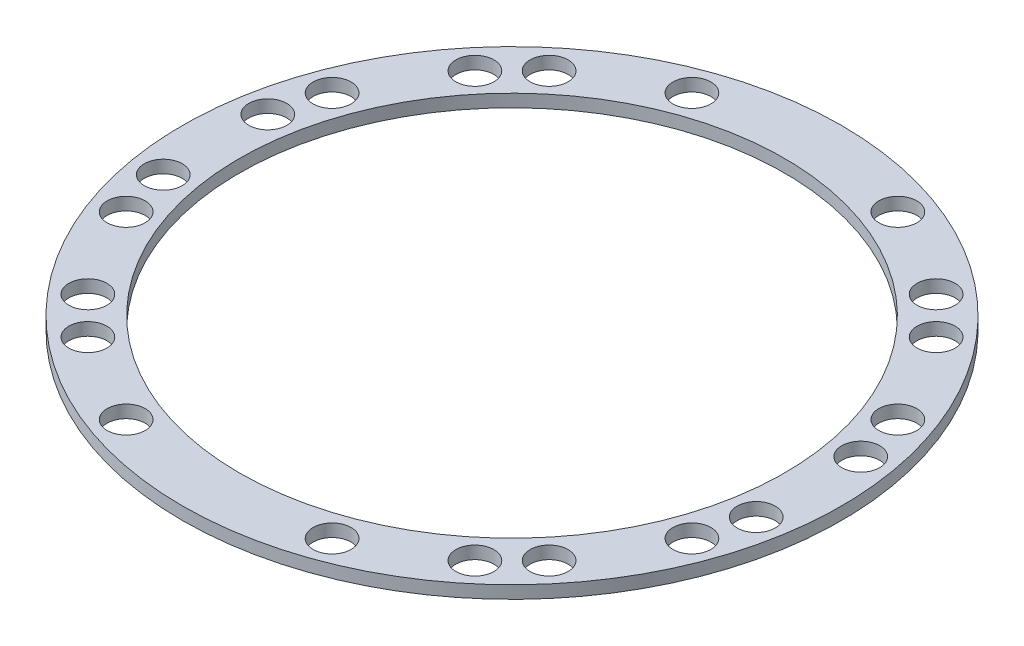
ISO-10303-21;
HEADER;
FILE_DESCRIPTION(('STEP AP214'),'2;1');
FILE_NAME('part.step','',(''),(''),'','','');
FILE_SCHEMA(('AUTOMOTIVE_DESIGN { 1 0 10303 214 1 1 1 1 }'));
ENDSEC;
DATA;
#1=APPLICATION_CONTEXT('core data for automotive mechanical design processes');
#2=APPLICATION_PROTOCOL_DEFINITION('international standard','automotive_design',2000,#1);
#3=PRODUCT_CONTEXT('',#1,'mechanical');
#4=PRODUCT('Part','Part','',(#3));
#5=PRODUCT_RELATED_PRODUCT_CATEGORY('part','',(#4));
#6=PRODUCT_DEFINITION_FORMATION('','',#4);
#7=PRODUCT_DEFINITION_CONTEXT('part definition',#1,'design');
#8=PRODUCT_DEFINITION('design','',#6,#7);
#9=PRODUCT_DEFINITION_SHAPE('','',#8);
#10=(LENGTH_UNIT() NAMED_UNIT(*) SI_UNIT(.MILLI.,.METRE.));
#11=(NAMED_UNIT(*) PLANE_ANGLE_UNIT() SI_UNIT($,.RADIAN.));
#12=(NAMED_UNIT(*) SI_UNIT($,.STERADIAN.) SOLID_ANGLE_UNIT());
#13=UNCERTAINTY_MEASURE_WITH_UNIT(LENGTH_MEASURE(1.E-05),#10,'distance_accuracy_value','');
#14=(GEOMETRIC_REPRESENTATION_CONTEXT(3) GLOBAL_UNCERTAINTY_ASSIGNED_CONTEXT((#13)) GLOBAL_UNIT_ASSIGNED_CONTEXT((#10,
#11,#12)) REPRESENTATION_CONTEXT('',''));
#15=CARTESIAN_POINT('',(0.,0.,0.));
#16=DIRECTION('',(0.,0.,1.));
#17=DIRECTION('',(1.,0.,0.));
#18=AXIS2_PLACEMENT_3D('',#15,#16,#17);
#19=CARTESIAN_POINT('',(0.,100.,0.));
#20=DIRECTION('',(0.,1.,0.));
#21=DIRECTION('',(0.,0.,1.));
#22=AXIS2_PLACEMENT_3D('',#19,#20,#21);
#23=PLANE('',#22);
#24=CARTESIAN_POINT('',(-2231.76997436654,100.,812.297840398455));
#25=DIRECTION('',(0.,-1.,0.));
#26=DIRECTION('',(-0.500000000000001,0.,0.866025403784438));
#27=AXIS2_PLACEMENT_3D('',#24,#25,#26);
#28=CIRCLE('',#27,150.);
#29=CARTESIAN_POINT('',(-2306.76997436654,100.,942.201650966121));
#30=VERTEX_POINT('',#29);
#31=EDGE_CURVE('E171',#30,#30,#28,.T.);
#32=ORIENTED_EDGE('',*,*,#31,.T.);
#33=EDGE_LOOP('',(#32));
#34=FACE_BOUND('',#33,.T.);
#35=CARTESIAN_POINT('',(-2338.91841340399,100.,-412.414421958971));
#36=DIRECTION('',(0.,-1.,0.));
#37=DIRECTION('',(-0.86602540378444,0.,0.499999999999998));
#38=AXIS2_PLACEMENT_3D('',#35,#36,#37);
#39=CIRCLE('',#38,150.);
#40=CARTESIAN_POINT('',(-2468.82222397166,100.,-337.414421958971));
#41=VERTEX_POINT('',#40);
#42=EDGE_CURVE('E211',#41,#41,#39,.T.);
#43=ORIENTED_EDGE('',*,*,#42,.T.);
#44=EDGE_LOOP('',(#43));
#45=FACE_BOUND('',#44,.T.);
#46=CARTESIAN_POINT('',(-1819.35555240756,100.,-1526.62057300554));
#47=DIRECTION('',(0.,-1.,0.));
#48=DIRECTION('',(-1.,0.,0.));
#49=AXIS2_PLACEMENT_3D('',#46,#47,#48);
#50=CIRCLE('',#49,150.);
#51=CARTESIAN_POINT('',(-1969.35555240756,100.,-1526.62057300554));
#52=VERTEX_POINT('',#51);
#53=EDGE_CURVE('E203',#52,#52,#50,.T.);
#54=ORIENTED_EDGE('',*,*,#53,.T.);
#55=EDGE_LOOP('',(#54));
#56=FACE_BOUND('',#55,.T.);
#57=CARTESIAN_POINT('',(-812.297840398448,100.,-2231.76997436654));
#58=DIRECTION('',(0.,-1.,0.));
#59=DIRECTION('',(-0.866025403784436,0.,-0.500000000000004));
#60=AXIS2_PLACEMENT_3D('',#57,#58,#59);
#61=CIRCLE('',#60,150.);
#62=CARTESIAN_POINT('',(-942.201650966113,100.,-2306.76997436654));
#63=VERTEX_POINT('',#62);
#64=EDGE_CURVE('E194',#63,#63,#61,.T.);
#65=ORIENTED_EDGE('',*,*,#64,.T.);
#66=EDGE_LOOP('',(#65));
#67=FACE_BOUND('',#66,.T.);
#68=CARTESIAN_POINT('',(-1819.35555240758,100.,1526.62057300553));
#69=DIRECTION('',(0.,-1.,0.));
#70=DIRECTION('',(-0.500000000000001,0.,0.866025403784438));
#71=AXIS2_PLACEMENT_3D('',#68,#69,#70);
#72=CIRCLE('',#71,150.);
#73=CARTESIAN_POINT('',(-1894.35555240758,100.,1656.52438357319));
#74=VERTEX_POINT('',#73);
#75=EDGE_CURVE('E151',#74,#74,#72,.T.);
#76=ORIENTED_EDGE('',*,*,#75,.T.);
#77=EDGE_LOOP('',(#76));
#78=FACE_BOUND('',#77,.T.);
#79=CARTESIAN_POINT('',(-2338.918413404,100.,412.414421958951));
#80=DIRECTION('',(0.,-1.,0.));
#81=DIRECTION('',(-0.86602540378444,0.,0.499999999999998));
#82=AXIS2_PLACEMENT_3D('',#79,#80,#81);
#83=CIRCLE('',#82,150.);
#84=CARTESIAN_POINT('',(-2468.82222397166,100.,487.414421958951));
#85=VERTEX_POINT('',#84);
#86=EDGE_CURVE('E180',#85,#85,#83,.T.);
#87=ORIENTED_EDGE('',*,*,#86,.T.);
#88=EDGE_LOOP('',(#87));
#89=FACE_BOUND('',#88,.T.);
#90=CARTESIAN_POINT('',(-2231.76997436653,100.,-812.297840398474));
#91=DIRECTION('',(0.,-1.,0.));
#92=DIRECTION('',(-1.,0.,0.));
#93=AXIS2_PLACEMENT_3D('',#90,#91,#92);
#94=CIRCLE('',#93,150.);
#95=CARTESIAN_POINT('',(-2381.76997436653,100.,-812.297840398474));
#96=VERTEX_POINT('',#95);
#97=EDGE_CURVE('E172',#96,#96,#94,.T.);
#98=ORIENTED_EDGE('',*,*,#97,.T.);
#99=EDGE_LOOP('',(#98));
#100=FACE_BOUND('',#99,.T.);
#101=CARTESIAN_POINT('',(-1526.62057300552,100.,-1819.35555240758));
#102=DIRECTION('',(0.,-1.,0.));
#103=DIRECTION('',(-0.866025403784436,0.,-0.500000000000004));
#104=AXIS2_PLACEMENT_3D('',#101,#102,#103);
#105=CIRCLE('',#104,150.);
#106=CARTESIAN_POINT('',(-1656.52438357319,100.,-1894.35555240758));
#107=VERTEX_POINT('',#106);
#108=EDGE_CURVE('E162',#107,#107,#105,.T.);
#109=ORIENTED_EDGE('',*,*,#108,.T.);
#110=EDGE_LOOP('',(#109));
#111=FACE_BOUND('',#110,.T.);
#112=CARTESIAN_POINT('',(-812.297840398466,100.,2231.76997436653));
#113=DIRECTION('',(0.,-1.,0.));
#114=DIRECTION('',(0.,0.,1.));
#115=AXIS2_PLACEMENT_3D('',#112,#113,#114);
#116=CIRCLE('',#115,150.);
#117=CARTESIAN_POINT('',(-812.297840398466,100.,2381.76997436653));
#118=VERTEX_POINT('',#117);
#119=EDGE_CURVE('E155',#118,#118,#116,.T.);
#120=ORIENTED_EDGE('',*,*,#119,.T.);
#121=EDGE_LOOP('',(#120));
#122=FACE_BOUND('',#121,.T.);
#123=CARTESIAN_POINT('',(-1526.62057300554,100.,1819.35555240757));
#124=DIRECTION('',(0.,-1.,0.));
#125=DIRECTION('',(0.,0.,1.));
#126=AXIS2_PLACEMENT_3D('',#123,#124,#125);
#127=CIRCLE('',#126,150.);
#128=CARTESIAN_POINT('',(-1526.62057300554,100.,1969.35555240757));
#129=VERTEX_POINT('',#128);
#130=EDGE_CURVE('E146',#129,#129,#127,.T.);
#131=ORIENTED_EDGE('',*,*,#130,.T.);
#132=EDGE_LOOP('',(#131));
#133=FACE_BOUND('',#132,.T.);
#134=CARTESIAN_POINT('',(2231.76997436654,100.,812.297840398455));
#135=DIRECTION('',(0.,1.,0.));
#136=DIRECTION('',(0.500000000000001,0.,0.866025403784438));
#137=AXIS2_PLACEMENT_3D('',#134,#135,#136);
#138=CIRCLE('',#137,150.);
#139=CARTESIAN_POINT('',(2306.76997436654,100.,942.201650966121));
#140=VERTEX_POINT('',#139);
#141=EDGE_CURVE('E91',#140,#140,#138,.T.);
#142=ORIENTED_EDGE('',*,*,#141,.F.);
#143=EDGE_LOOP('',(#142));
#144=FACE_BOUND('',#143,.T.);
#145=CARTESIAN_POINT('',(2338.91841340399,100.,-412.414421958971));
#146=DIRECTION('',(0.,1.,0.));
#147=DIRECTION('',(0.86602540378444,0.,0.499999999999998));
#148=AXIS2_PLACEMENT_3D('',#145,#146,#147);
#149=CIRCLE('',#148,150.);
#150=CARTESIAN_POINT('',(2468.82222397166,100.,-337.414421958971));
#151=VERTEX_POINT('',#150);
#152=EDGE_CURVE('E132',#151,#151,#149,.T.);
#153=ORIENTED_EDGE('',*,*,#152,.F.);
#154=EDGE_LOOP('',(#153));
#155=FACE_BOUND('',#154,.T.);
#156=CARTESIAN_POINT('',(1819.35555240756,100.,-1526.62057300554));
#157=DIRECTION('',(0.,1.,0.));
#158=DIRECTION('',(1.,0.,0.));
#159=AXIS2_PLACEMENT_3D('',#156,#157,#158);
#160=CIRCLE('',#159,150.);
#161=CARTESIAN_POINT('',(1969.35555240756,100.,-1526.62057300554));
#162=VERTEX_POINT('',#161);
#163=EDGE_CURVE('E124',#162,#162,#160,.T.);
#164=ORIENTED_EDGE('',*,*,#163,.F.);
#165=EDGE_LOOP('',(#164));
#166=FACE_BOUND('',#165,.T.);
#167=CARTESIAN_POINT('',(812.297840398448,100.,-2231.76997436654));
#168=DIRECTION('',(0.,1.,0.));
#169=DIRECTION('',(0.866025403784436,0.,-0.500000000000004));
#170=AXIS2_PLACEMENT_3D('',#167,#168,#169);
#171=CIRCLE('',#170,150.);
#172=CARTESIAN_POINT('',(942.201650966113,100.,-2306.76997436654));
#173=VERTEX_POINT('',#172);
#174=EDGE_CURVE('E114',#173,#173,#171,.T.);
#175=ORIENTED_EDGE('',*,*,#174,.F.);
#176=EDGE_LOOP('',(#175));
#177=FACE_BOUND('',#176,.T.);
#178=CARTESIAN_POINT('',(1819.35555240758,100.,1526.62057300553));
#179=DIRECTION('',(0.,1.,0.));
#180=DIRECTION('',(0.500000000000001,0.,0.866025403784438));
#181=AXIS2_PLACEMENT_3D('',#178,#179,#180);
#182=CIRCLE('',#181,150.);
#183=CARTESIAN_POINT('',(1894.35555240758,100.,1656.52438357319));
#184=VERTEX_POINT('',#183);
#185=EDGE_CURVE('E71',#184,#184,#182,.T.);
#186=ORIENTED_EDGE('',*,*,#185,.F.);
#187=EDGE_LOOP('',(#186));
#188=FACE_BOUND('',#187,.T.);
#189=CARTESIAN_POINT('',(2338.918413404,100.,412.414421958951));
#190=DIRECTION('',(0.,1.,0.));
#191=DIRECTION('',(0.86602540378444,0.,0.499999999999998));
#192=AXIS2_PLACEMENT_3D('',#189,#190,#191);
#193=CIRCLE('',#192,150.);
#194=CARTESIAN_POINT('',(2468.82222397166,100.,487.414421958951));
#195=VERTEX_POINT('',#194);
#196=EDGE_CURVE('E100',#195,#195,#193,.T.);
#197=ORIENTED_EDGE('',*,*,#196,.F.);
#198=EDGE_LOOP('',(#197));
#199=FACE_BOUND('',#198,.T.);
#200=CARTESIAN_POINT('',(2231.76997436653,100.,-812.297840398474));
#201=DIRECTION('',(0.,1.,0.));
#202=DIRECTION('',(1.,0.,0.));
#203=AXIS2_PLACEMENT_3D('',#200,#201,#202);
#204=CIRCLE('',#203,150.);
#205=CARTESIAN_POINT('',(2381.76997436653,100.,-812.297840398474));
#206=VERTEX_POINT('',#205);
#207=EDGE_CURVE('E92',#206,#206,#204,.T.);
#208=ORIENTED_EDGE('',*,*,#207,.F.);
#209=EDGE_LOOP('',(#208));
#210=FACE_BOUND('',#209,.T.);
#211=CARTESIAN_POINT('',(1526.62057300552,100.,-1819.35555240758));
#212=DIRECTION('',(0.,1.,0.));
#213=DIRECTION('',(0.866025403784436,0.,-0.500000000000004));
#214=AXIS2_PLACEMENT_3D('',#211,#212,#213);
#215=CIRCLE('',#214,150.);
#216=CARTESIAN_POINT('',(1656.52438357319,100.,-1894.35555240758));
#217=VERTEX_POINT('',#216);
#218=EDGE_CURVE('E82',#217,#217,#215,.T.);
#219=ORIENTED_EDGE('',*,*,#218,.F.);
#220=EDGE_LOOP('',(#219));
#221=FACE_BOUND('',#220,.T.);
#222=CARTESIAN_POINT('',(812.297840398466,100.,2231.76997436653));
#223=DIRECTION('',(0.,1.,0.));
#224=DIRECTION('',(0.,0.,1.));
#225=AXIS2_PLACEMENT_3D('',#222,#223,#224);
#226=CIRCLE('',#225,150.);
#227=CARTESIAN_POINT('',(812.297840398466,100.,2381.76997436653));
#228=VERTEX_POINT('',#227);
#229=EDGE_CURVE('E75',#228,#228,#226,.T.);
#230=ORIENTED_EDGE('',*,*,#229,.F.);
#231=EDGE_LOOP('',(#230));
#232=FACE_BOUND('',#231,.T.);
#233=CARTESIAN_POINT('',(1526.62057300554,100.,1819.35555240757));
#234=DIRECTION('',(0.,1.,0.));
#235=DIRECTION('',(0.,0.,1.));
#236=AXIS2_PLACEMENT_3D('',#233,#234,#235);
#237=CIRCLE('',#236,150.);
#238=CARTESIAN_POINT('',(1526.62057300554,100.,1969.35555240757));
#239=VERTEX_POINT('',#238);
#240=EDGE_CURVE('E70',#239,#239,#237,.T.);
#241=ORIENTED_EDGE('',*,*,#240,.F.);
#242=EDGE_LOOP('',(#241));
#243=FACE_BOUND('',#242,.T.);
#244=CARTESIAN_POINT('',(0.,100.,0.));
#245=DIRECTION('',(0.,1.,0.));
#246=DIRECTION('',(0.,0.,1.));
#247=AXIS2_PLACEMENT_3D('',#244,#245,#246);
#248=CIRCLE('',#247,2600.);
#249=CARTESIAN_POINT('',(0.,100.,2600.));
#250=VERTEX_POINT('',#249);
#251=EDGE_CURVE('E10',#250,#250,#248,.T.);
#252=ORIENTED_EDGE('',*,*,#251,.T.);
#253=EDGE_LOOP('',(#252));
#254=FACE_BOUND('',#253,.T.);
#255=CARTESIAN_POINT('',(0.,100.,0.));
#256=DIRECTION('',(0.,1.,0.));
#257=DIRECTION('',(0.,0.,1.));
#258=AXIS2_PLACEMENT_3D('',#255,#256,#257);
#259=CIRCLE('',#258,2150.);
#260=CARTESIAN_POINT('',(0.,100.,2150.));
#261=VERTEX_POINT('',#260);
#262=EDGE_CURVE('E56',#261,#261,#259,.T.);
#263=ORIENTED_EDGE('',*,*,#262,.F.);
#264=EDGE_LOOP('',(#263));
#265=FACE_BOUND('',#264,.T.);
#266=ADVANCED_FACE('F43',(#34,#45,#56,#67,#78,#89,#100,#111,#122,#133,#144,#155,#166,#177,#188,
#199,#210,#221,#232,#243,#254,#265),#23,.T.);
#267=CARTESIAN_POINT('',(0.,0.,0.));
#268=DIRECTION('',(0.,1.,0.));
#269=DIRECTION('',(0.,0.,1.));
#270=AXIS2_PLACEMENT_3D('',#267,#268,#269);
#271=PLANE('',#270);
#272=CARTESIAN_POINT('',(-2231.76997436654,0.,812.297840398455));
#273=DIRECTION('',(0.,-1.,0.));
#274=DIRECTION('',(-0.500000000000001,0.,0.866025403784438));
#275=AXIS2_PLACEMENT_3D('',#272,#273,#274);
#276=CIRCLE('',#275,150.);
#277=CARTESIAN_POINT('',(-2306.76997436654,0.,942.201650966121));
#278=VERTEX_POINT('',#277);
#279=EDGE_CURVE('E215',#278,#278,#276,.T.);
#280=ORIENTED_EDGE('',*,*,#279,.F.);
#281=EDGE_LOOP('',(#280));
#282=FACE_BOUND('',#281,.T.);
#283=CARTESIAN_POINT('',(-2338.91841340399,0.,-412.414421958971));
#284=DIRECTION('',(0.,-1.,0.));
#285=DIRECTION('',(-0.86602540378444,0.,0.499999999999998));
#286=AXIS2_PLACEMENT_3D('',#283,#284,#285);
#287=CIRCLE('',#286,150.);
#288=CARTESIAN_POINT('',(-2468.82222397166,0.,-337.414421958971));
#289=VERTEX_POINT('',#288);
#290=EDGE_CURVE('E207',#289,#289,#287,.T.);
#291=ORIENTED_EDGE('',*,*,#290,.F.);
#292=EDGE_LOOP('',(#291));
#293=FACE_BOUND('',#292,.T.);
#294=CARTESIAN_POINT('',(-1819.35555240756,0.,-1526.62057300554));
#295=DIRECTION('',(0.,-1.,0.));
#296=DIRECTION('',(-1.,0.,0.));
#297=AXIS2_PLACEMENT_3D('',#294,#295,#296);
#298=CIRCLE('',#297,150.);
#299=CARTESIAN_POINT('',(-1969.35555240756,0.,-1526.62057300554));
#300=VERTEX_POINT('',#299);
#301=EDGE_CURVE('E198',#300,#300,#298,.T.);
#302=ORIENTED_EDGE('',*,*,#301,.F.);
#303=EDGE_LOOP('',(#302));
#304=FACE_BOUND('',#303,.T.);
#305=CARTESIAN_POINT('',(-812.297840398448,0.,-2231.76997436654));
#306=DIRECTION('',(0.,-1.,0.));
#307=DIRECTION('',(-0.866025403784436,0.,-0.500000000000004));
#308=AXIS2_PLACEMENT_3D('',#305,#306,#307);
#309=CIRCLE('',#308,150.);
#310=CARTESIAN_POINT('',(-942.201650966113,0.,-2306.76997436654));
#311=VERTEX_POINT('',#310);
#312=EDGE_CURVE('E199',#311,#311,#309,.T.);
#313=ORIENTED_EDGE('',*,*,#312,.F.);
#314=EDGE_LOOP('',(#313));
#315=FACE_BOUND('',#314,.T.);
#316=CARTESIAN_POINT('',(-1819.35555240758,0.,1526.62057300553));
#317=DIRECTION('',(0.,-1.,0.));
#318=DIRECTION('',(-0.500000000000001,0.,0.866025403784438));
#319=AXIS2_PLACEMENT_3D('',#316,#317,#318);
#320=CIRCLE('',#319,150.);
#321=CARTESIAN_POINT('',(-1894.35555240758,0.,1656.52438357319));
#322=VERTEX_POINT('',#321);
#323=EDGE_CURVE('E184',#322,#322,#320,.T.);
#324=ORIENTED_EDGE('',*,*,#323,.F.);
#325=EDGE_LOOP('',(#324));
#326=FACE_BOUND('',#325,.T.);
#327=CARTESIAN_POINT('',(-2338.918413404,0.,412.414421958951));
#328=DIRECTION('',(0.,-1.,0.));
#329=DIRECTION('',(-0.86602540378444,0.,0.499999999999998));
#330=AXIS2_PLACEMENT_3D('',#327,#328,#329);
#331=CIRCLE('',#330,150.);
#332=CARTESIAN_POINT('',(-2468.82222397166,0.,487.414421958951));
#333=VERTEX_POINT('',#332);
#334=EDGE_CURVE('E176',#333,#333,#331,.T.);
#335=ORIENTED_EDGE('',*,*,#334,.F.);
#336=EDGE_LOOP('',(#335));
#337=FACE_BOUND('',#336,.T.);
#338=CARTESIAN_POINT('',(-2231.76997436653,0.,-812.297840398474));
#339=DIRECTION('',(0.,-1.,0.));
#340=DIRECTION('',(-1.,0.,0.));
#341=AXIS2_PLACEMENT_3D('',#338,#339,#340);
#342=CIRCLE('',#341,150.);
#343=CARTESIAN_POINT('',(-2381.76997436653,0.,-812.297840398474));
#344=VERTEX_POINT('',#343);
#345=EDGE_CURVE('E166',#344,#344,#342,.T.);
#346=ORIENTED_EDGE('',*,*,#345,.F.);
#347=EDGE_LOOP('',(#346));
#348=FACE_BOUND('',#347,.T.);
#349=CARTESIAN_POINT('',(-1526.62057300552,0.,-1819.35555240758));
#350=DIRECTION('',(0.,-1.,0.));
#351=DIRECTION('',(-0.866025403784436,0.,-0.500000000000004));
#352=AXIS2_PLACEMENT_3D('',#349,#350,#351);
#353=CIRCLE('',#352,150.);
#354=CARTESIAN_POINT('',(-1656.52438357319,0.,-1894.35555240758));
#355=VERTEX_POINT('',#354);
#356=EDGE_CURVE('E167',#355,#355,#353,.T.);
#357=ORIENTED_EDGE('',*,*,#356,.F.);
#358=EDGE_LOOP('',(#357));
#359=FACE_BOUND('',#358,.T.);
#360=CARTESIAN_POINT('',(-812.297840398466,0.,2231.76997436653));
#361=DIRECTION('',(0.,-1.,0.));
#362=DIRECTION('',(0.,0.,1.));
#363=AXIS2_PLACEMENT_3D('',#360,#361,#362);
#364=CIRCLE('',#363,150.);
#365=CARTESIAN_POINT('',(-812.297840398466,0.,2381.76997436653));
#366=VERTEX_POINT('',#365);
#367=EDGE_CURVE('E123',#366,#366,#364,.T.);
#368=ORIENTED_EDGE('',*,*,#367,.F.);
#369=EDGE_LOOP('',(#368));
#370=FACE_BOUND('',#369,.T.);
#371=CARTESIAN_POINT('',(-1526.62057300554,0.,1819.35555240757));
#372=DIRECTION('',(0.,-1.,0.));
#373=DIRECTION('',(0.,0.,1.));
#374=AXIS2_PLACEMENT_3D('',#371,#372,#373);
#375=CIRCLE('',#374,150.);
#376=CARTESIAN_POINT('',(-1526.62057300554,0.,1969.35555240757));
#377=VERTEX_POINT('',#376);
#378=EDGE_CURVE('E150',#377,#377,#375,.T.);
#379=ORIENTED_EDGE('',*,*,#378,.F.);
#380=EDGE_LOOP('',(#379));
#381=FACE_BOUND('',#380,.T.);
#382=CARTESIAN_POINT('',(2231.76997436654,0.,812.297840398455));
#383=DIRECTION('',(0.,1.,0.));
#384=DIRECTION('',(0.500000000000001,0.,0.866025403784438));
#385=AXIS2_PLACEMENT_3D('',#382,#383,#384);
#386=CIRCLE('',#385,150.);
#387=CARTESIAN_POINT('',(2306.76997436654,0.,942.201650966121));
#388=VERTEX_POINT('',#387);
#389=EDGE_CURVE('E136',#388,#388,#386,.T.);
#390=ORIENTED_EDGE('',*,*,#389,.T.);
#391=EDGE_LOOP('',(#390));
#392=FACE_BOUND('',#391,.T.);
#393=CARTESIAN_POINT('',(2338.91841340399,0.,-412.414421958971));
#394=DIRECTION('',(0.,1.,0.));
#395=DIRECTION('',(0.86602540378444,0.,0.499999999999998));
#396=AXIS2_PLACEMENT_3D('',#393,#394,#395);
#397=CIRCLE('',#396,150.);
#398=CARTESIAN_POINT('',(2468.82222397166,0.,-337.414421958971));
#399=VERTEX_POINT('',#398);
#400=EDGE_CURVE('E128',#399,#399,#397,.T.);
#401=ORIENTED_EDGE('',*,*,#400,.T.);
#402=EDGE_LOOP('',(#401));
#403=FACE_BOUND('',#402,.T.);
#404=CARTESIAN_POINT('',(1819.35555240756,0.,-1526.62057300554));
#405=DIRECTION('',(0.,1.,0.));
#406=DIRECTION('',(1.,0.,0.));
#407=AXIS2_PLACEMENT_3D('',#404,#405,#406);
#408=CIRCLE('',#407,150.);
#409=CARTESIAN_POINT('',(1969.35555240756,0.,-1526.62057300554));
#410=VERTEX_POINT('',#409);
#411=EDGE_CURVE('E118',#410,#410,#408,.T.);
#412=ORIENTED_EDGE('',*,*,#411,.T.);
#413=EDGE_LOOP('',(#412));
#414=FACE_BOUND('',#413,.T.);
#415=CARTESIAN_POINT('',(812.297840398448,0.,-2231.76997436654));
#416=DIRECTION('',(0.,1.,0.));
#417=DIRECTION('',(0.866025403784436,0.,-0.500000000000004));
#418=AXIS2_PLACEMENT_3D('',#415,#416,#417);
#419=CIRCLE('',#418,150.);
#420=CARTESIAN_POINT('',(942.201650966113,0.,-2306.76997436654));
#421=VERTEX_POINT('',#420);
#422=EDGE_CURVE('E119',#421,#421,#419,.T.);
#423=ORIENTED_EDGE('',*,*,#422,.T.);
#424=EDGE_LOOP('',(#423));
#425=FACE_BOUND('',#424,.T.);
#426=CARTESIAN_POINT('',(1819.35555240758,0.,1526.62057300553));
#427=DIRECTION('',(0.,1.,0.));
#428=DIRECTION('',(0.500000000000001,0.,0.866025403784438));
#429=AXIS2_PLACEMENT_3D('',#426,#427,#428);
#430=CIRCLE('',#429,150.);
#431=CARTESIAN_POINT('',(1894.35555240758,0.,1656.52438357319));
#432=VERTEX_POINT('',#431);
#433=EDGE_CURVE('E104',#432,#432,#430,.T.);
#434=ORIENTED_EDGE('',*,*,#433,.T.);
#435=EDGE_LOOP('',(#434));
#436=FACE_BOUND('',#435,.T.);
#437=CARTESIAN_POINT('',(2338.918413404,0.,412.414421958951));
#438=DIRECTION('',(0.,1.,0.));
#439=DIRECTION('',(0.86602540378444,0.,0.499999999999998));
#440=AXIS2_PLACEMENT_3D('',#437,#438,#439);
#441=CIRCLE('',#440,150.);
#442=CARTESIAN_POINT('',(2468.82222397166,0.,487.414421958951));
#443=VERTEX_POINT('',#442);
#444=EDGE_CURVE('E96',#443,#443,#441,.T.);
#445=ORIENTED_EDGE('',*,*,#444,.T.);
#446=EDGE_LOOP('',(#445));
#447=FACE_BOUND('',#446,.T.);
#448=CARTESIAN_POINT('',(2231.76997436653,0.,-812.297840398474));
#449=DIRECTION('',(0.,1.,0.));
#450=DIRECTION('',(1.,0.,0.));
#451=AXIS2_PLACEMENT_3D('',#448,#449,#450);
#452=CIRCLE('',#451,150.);
#453=CARTESIAN_POINT('',(2381.76997436653,0.,-812.297840398474));
#454=VERTEX_POINT('',#453);
#455=EDGE_CURVE('E86',#454,#454,#452,.T.);
#456=ORIENTED_EDGE('',*,*,#455,.T.);
#457=EDGE_LOOP('',(#456));
#458=FACE_BOUND('',#457,.T.);
#459=CARTESIAN_POINT('',(1526.62057300552,0.,-1819.35555240758));
#460=DIRECTION('',(0.,1.,0.));
#461=DIRECTION('',(0.866025403784436,0.,-0.500000000000004));
#462=AXIS2_PLACEMENT_3D('',#459,#460,#461);
#463=CIRCLE('',#462,150.);
#464=CARTESIAN_POINT('',(1656.52438357319,0.,-1894.35555240758));
#465=VERTEX_POINT('',#464);
#466=EDGE_CURVE('E87',#465,#465,#463,.T.);
#467=ORIENTED_EDGE('',*,*,#466,.T.);
#468=EDGE_LOOP('',(#467));
#469=FACE_BOUND('',#468,.T.);
#470=CARTESIAN_POINT('',(812.297840398466,0.,2231.76997436653));
#471=DIRECTION('',(0.,1.,0.));
#472=DIRECTION('',(0.,0.,1.));
#473=AXIS2_PLACEMENT_3D('',#470,#471,#472);
#474=CIRCLE('',#473,150.);
#475=CARTESIAN_POINT('',(812.297840398466,0.,2381.76997436653));
#476=VERTEX_POINT('',#475);
#477=EDGE_CURVE('E62',#476,#476,#474,.T.);
#478=ORIENTED_EDGE('',*,*,#477,.T.);
#479=EDGE_LOOP('',(#478));
#480=FACE_BOUND('',#479,.T.);
#481=CARTESIAN_POINT('',(1526.62057300554,0.,1819.35555240757));
#482=DIRECTION('',(0.,1.,0.));
#483=DIRECTION('',(0.,0.,1.));
#484=AXIS2_PLACEMENT_3D('',#481,#482,#483);
#485=CIRCLE('',#484,150.);
#486=CARTESIAN_POINT('',(1526.62057300554,0.,1969.35555240757));
#487=VERTEX_POINT('',#486);
#488=EDGE_CURVE('E66',#487,#487,#485,.T.);
#489=ORIENTED_EDGE('',*,*,#488,.T.);
#490=EDGE_LOOP('',(#489));
#491=FACE_BOUND('',#490,.T.);
#492=CARTESIAN_POINT('',(0.,0.,0.));
#493=DIRECTION('',(0.,1.,0.));
#494=DIRECTION('',(0.,0.,1.));
#495=AXIS2_PLACEMENT_3D('',#492,#493,#494);
#496=CIRCLE('',#495,2600.);
#497=CARTESIAN_POINT('',(0.,0.,2600.));
#498=VERTEX_POINT('',#497);
#499=EDGE_CURVE('E47',#498,#498,#496,.T.);
#500=ORIENTED_EDGE('',*,*,#499,.F.);
#501=EDGE_LOOP('',(#500));
#502=FACE_BOUND('',#501,.T.);
#503=CARTESIAN_POINT('',(0.,0.,0.));
#504=DIRECTION('',(0.,1.,0.));
#505=DIRECTION('',(0.,0.,1.));
#506=AXIS2_PLACEMENT_3D('',#503,#504,#505);
#507=CIRCLE('',#506,2150.);
#508=CARTESIAN_POINT('',(0.,0.,2150.));
#509=VERTEX_POINT('',#508);
#510=EDGE_CURVE('E58',#509,#509,#507,.T.);
#511=ORIENTED_EDGE('',*,*,#510,.T.);
#512=EDGE_LOOP('',(#511));
#513=FACE_BOUND('',#512,.T.);
#514=ADVANCED_FACE('F229',(#282,#293,#304,#315,#326,#337,#348,#359,#370,#381,#392,#403,#414,
#425,#436,#447,#458,#469,#480,#491,#502,#513),#271,.F.);
#515=CARTESIAN_POINT('',(0.,100.,0.));
#516=DIRECTION('',(0.,-1.,0.));
#517=DIRECTION('',(0.,0.,-1.));
#518=AXIS2_PLACEMENT_3D('',#515,#516,#517);
#519=CYLINDRICAL_SURFACE('',#518,2600.);
#520=ORIENTED_EDGE('',*,*,#251,.F.);
#521=EDGE_LOOP('',(#520));
#522=FACE_BOUND('',#521,.T.);
#523=ORIENTED_EDGE('',*,*,#499,.T.);
#524=EDGE_LOOP('',(#523));
#525=FACE_BOUND('',#524,.T.);
#526=ADVANCED_FACE('F45',(#522,#525),#519,.T.);
#527=CARTESIAN_POINT('',(0.,100.,0.));
#528=DIRECTION('',(0.,-1.,0.));
#529=DIRECTION('',(0.,0.,-1.));
#530=AXIS2_PLACEMENT_3D('',#527,#528,#529);
#531=CYLINDRICAL_SURFACE('',#530,2150.);
#532=ORIENTED_EDGE('',*,*,#262,.T.);
#533=EDGE_LOOP('',(#532));
#534=FACE_BOUND('',#533,.T.);
#535=ORIENTED_EDGE('',*,*,#510,.F.);
#536=EDGE_LOOP('',(#535));
#537=FACE_BOUND('',#536,.T.);
#538=ADVANCED_FACE('F274',(#534,#537),#531,.F.);
#539=CARTESIAN_POINT('',(1526.62057300554,0.,1819.35555240757));
#540=DIRECTION('',(0.,1.,0.));
#541=DIRECTION('',(0.,0.,1.));
#542=AXIS2_PLACEMENT_3D('',#539,#540,#541);
#543=CYLINDRICAL_SURFACE('',#542,150.);
#544=ORIENTED_EDGE('',*,*,#488,.F.);
#545=EDGE_LOOP('',(#544));
#546=FACE_BOUND('',#545,.T.);
#547=ORIENTED_EDGE('',*,*,#240,.T.);
#548=EDGE_LOOP('',(#547));
#549=FACE_BOUND('',#548,.T.);
#550=ADVANCED_FACE('F276',(#546,#549),#543,.F.);
#551=CARTESIAN_POINT('',(812.297840398466,0.,2231.76997436653));
#552=DIRECTION('',(0.,1.,0.));
#553=DIRECTION('',(0.,0.,1.));
#554=AXIS2_PLACEMENT_3D('',#551,#552,#553);
#555=CYLINDRICAL_SURFACE('',#554,150.);
#556=ORIENTED_EDGE('',*,*,#477,.F.);
#557=EDGE_LOOP('',(#556));
#558=FACE_BOUND('',#557,.T.);
#559=ORIENTED_EDGE('',*,*,#229,.T.);
#560=EDGE_LOOP('',(#559));
#561=FACE_BOUND('',#560,.T.);
#562=ADVANCED_FACE('F283',(#558,#561),#555,.F.);
#563=CARTESIAN_POINT('',(1526.62057300552,0.,-1819.35555240758));
#564=DIRECTION('',(0.,1.,0.));
#565=DIRECTION('',(0.866025403784436,0.,-0.500000000000004));
#566=AXIS2_PLACEMENT_3D('',#563,#564,#565);
#567=CYLINDRICAL_SURFACE('',#566,150.);
#568=ORIENTED_EDGE('',*,*,#466,.F.);
#569=EDGE_LOOP('',(#568));
#570=FACE_BOUND('',#569,.T.);
#571=ORIENTED_EDGE('',*,*,#218,.T.);
#572=EDGE_LOOP('',(#571));
#573=FACE_BOUND('',#572,.T.);
#574=ADVANCED_FACE('F337',(#570,#573),#567,.F.);
#575=CARTESIAN_POINT('',(2231.76997436653,0.,-812.297840398474));
#576=DIRECTION('',(0.,1.,0.));
#577=DIRECTION('',(1.,0.,0.));
#578=AXIS2_PLACEMENT_3D('',#575,#576,#577);
#579=CYLINDRICAL_SURFACE('',#578,150.);
#580=ORIENTED_EDGE('',*,*,#455,.F.);
#581=EDGE_LOOP('',(#580));
#582=FACE_BOUND('',#581,.T.);
#583=ORIENTED_EDGE('',*,*,#207,.T.);
#584=EDGE_LOOP('',(#583));
#585=FACE_BOUND('',#584,.T.);
#586=ADVANCED_FACE('F343',(#582,#585),#579,.F.);
#587=CARTESIAN_POINT('',(2338.918413404,0.,412.414421958951));
#588=DIRECTION('',(0.,1.,0.));
#589=DIRECTION('',(0.86602540378444,0.,0.499999999999998));
#590=AXIS2_PLACEMENT_3D('',#587,#588,#589);
#591=CYLINDRICAL_SURFACE('',#590,150.);
#592=ORIENTED_EDGE('',*,*,#444,.F.);
#593=EDGE_LOOP('',(#592));
#594=FACE_BOUND('',#593,.T.);
#595=ORIENTED_EDGE('',*,*,#196,.T.);
#596=EDGE_LOOP('',(#595));
#597=FACE_BOUND('',#596,.T.);
#598=ADVANCED_FACE('F349',(#594,#597),#591,.F.);
#599=CARTESIAN_POINT('',(1819.35555240758,0.,1526.62057300553));
#600=DIRECTION('',(0.,1.,0.));
#601=DIRECTION('',(0.500000000000001,0.,0.866025403784438));
#602=AXIS2_PLACEMENT_3D('',#599,#600,#601);
#603=CYLINDRICAL_SURFACE('',#602,150.);
#604=ORIENTED_EDGE('',*,*,#433,.F.);
#605=EDGE_LOOP('',(#604));
#606=FACE_BOUND('',#605,.T.);
#607=ORIENTED_EDGE('',*,*,#185,.T.);
#608=EDGE_LOOP('',(#607));
#609=FACE_BOUND('',#608,.T.);
#610=ADVANCED_FACE('F353',(#606,#609),#603,.F.);
#611=CARTESIAN_POINT('',(812.297840398448,0.,-2231.76997436654));
#612=DIRECTION('',(0.,1.,0.));
#613=DIRECTION('',(0.866025403784436,0.,-0.500000000000004));
#614=AXIS2_PLACEMENT_3D('',#611,#612,#613);
#615=CYLINDRICAL_SURFACE('',#614,150.);
#616=ORIENTED_EDGE('',*,*,#422,.F.);
#617=EDGE_LOOP('',(#616));
#618=FACE_BOUND('',#617,.T.);
#619=ORIENTED_EDGE('',*,*,#174,.T.);
#620=EDGE_LOOP('',(#619));
#621=FACE_BOUND('',#620,.T.);
#622=ADVANCED_FACE('F357',(#618,#621),#615,.F.);
#623=CARTESIAN_POINT('',(1819.35555240756,0.,-1526.62057300554));
#624=DIRECTION('',(0.,1.,0.));
#625=DIRECTION('',(1.,0.,0.));
#626=AXIS2_PLACEMENT_3D('',#623,#624,#625);
#627=CYLINDRICAL_SURFACE('',#626,150.);
#628=ORIENTED_EDGE('',*,*,#411,.F.);
#629=EDGE_LOOP('',(#628));
#630=FACE_BOUND('',#629,.T.);
#631=ORIENTED_EDGE('',*,*,#163,.T.);
#632=EDGE_LOOP('',(#631));
#633=FACE_BOUND('',#632,.T.);
#634=ADVANCED_FACE('F361',(#630,#633),#627,.F.);
#635=CARTESIAN_POINT('',(2338.91841340399,0.,-412.414421958971));
#636=DIRECTION('',(0.,1.,0.));
#637=DIRECTION('',(0.86602540378444,0.,0.499999999999998));
#638=AXIS2_PLACEMENT_3D('',#635,#636,#637);
#639=CYLINDRICAL_SURFACE('',#638,150.);
#640=ORIENTED_EDGE('',*,*,#400,.F.);
#641=EDGE_LOOP('',(#640));
#642=FACE_BOUND('',#641,.T.);
#643=ORIENTED_EDGE('',*,*,#152,.T.);
#644=EDGE_LOOP('',(#643));
#645=FACE_BOUND('',#644,.T.);
#646=ADVANCED_FACE('F365',(#642,#645),#639,.F.);
#647=CARTESIAN_POINT('',(2231.76997436654,0.,812.297840398455));
#648=DIRECTION('',(0.,1.,0.));
#649=DIRECTION('',(0.500000000000001,0.,0.866025403784438));
#650=AXIS2_PLACEMENT_3D('',#647,#648,#649);
#651=CYLINDRICAL_SURFACE('',#650,150.);
#652=ORIENTED_EDGE('',*,*,#389,.F.);
#653=EDGE_LOOP('',(#652));
#654=FACE_BOUND('',#653,.T.);
#655=ORIENTED_EDGE('',*,*,#141,.T.);
#656=EDGE_LOOP('',(#655));
#657=FACE_BOUND('',#656,.T.);
#658=ADVANCED_FACE('F369',(#654,#657),#651,.F.);
#659=CARTESIAN_POINT('',(-1526.62057300554,0.,1819.35555240757));
#660=DIRECTION('',(0.,1.,0.));
#661=DIRECTION('',(0.,0.,1.));
#662=AXIS2_PLACEMENT_3D('',#659,#660,#661);
#663=CYLINDRICAL_SURFACE('',#662,150.);
#664=ORIENTED_EDGE('',*,*,#378,.T.);
#665=EDGE_LOOP('',(#664));
#666=FACE_BOUND('',#665,.T.);
#667=ORIENTED_EDGE('',*,*,#130,.F.);
#668=EDGE_LOOP('',(#667));
#669=FACE_BOUND('',#668,.T.);
#670=ADVANCED_FACE('F372',(#666,#669),#663,.F.);
#671=CARTESIAN_POINT('',(-812.297840398466,0.,2231.76997436653));
#672=DIRECTION('',(0.,1.,0.));
#673=DIRECTION('',(0.,0.,1.));
#674=AXIS2_PLACEMENT_3D('',#671,#672,#673);
#675=CYLINDRICAL_SURFACE('',#674,150.);
#676=ORIENTED_EDGE('',*,*,#367,.T.);
#677=EDGE_LOOP('',(#676));
#678=FACE_BOUND('',#677,.T.);
#679=ORIENTED_EDGE('',*,*,#119,.F.);
#680=EDGE_LOOP('',(#679));
#681=FACE_BOUND('',#680,.T.);
#682=ADVANCED_FACE('F376',(#678,#681),#675,.F.);
#683=CARTESIAN_POINT('',(-1526.62057300552,0.,-1819.35555240758));
#684=DIRECTION('',(0.,1.,0.));
#685=DIRECTION('',(-0.866025403784436,0.,-0.500000000000004));
#686=AXIS2_PLACEMENT_3D('',#683,#684,#685);
#687=CYLINDRICAL_SURFACE('',#686,150.);
#688=ORIENTED_EDGE('',*,*,#356,.T.);
#689=EDGE_LOOP('',(#688));
#690=FACE_BOUND('',#689,.T.);
#691=ORIENTED_EDGE('',*,*,#108,.F.);
#692=EDGE_LOOP('',(#691));
#693=FACE_BOUND('',#692,.T.);
#694=ADVANCED_FACE('F380',(#690,#693),#687,.F.);
#695=CARTESIAN_POINT('',(-2231.76997436653,0.,-812.297840398474));
#696=DIRECTION('',(0.,1.,0.));
#697=DIRECTION('',(-1.,0.,0.));
#698=AXIS2_PLACEMENT_3D('',#695,#696,#697);
#699=CYLINDRICAL_SURFACE('',#698,150.);
#700=ORIENTED_EDGE('',*,*,#345,.T.);
#701=EDGE_LOOP('',(#700));
#702=FACE_BOUND('',#701,.T.);
#703=ORIENTED_EDGE('',*,*,#97,.F.);
#704=EDGE_LOOP('',(#703));
#705=FACE_BOUND('',#704,.T.);
#706=ADVANCED_FACE('F384',(#702,#705),#699,.F.);
#707=CARTESIAN_POINT('',(-2338.918413404,0.,412.414421958951));
#708=DIRECTION('',(0.,1.,0.));
#709=DIRECTION('',(-0.86602540378444,0.,0.499999999999998));
#710=AXIS2_PLACEMENT_3D('',#707,#708,#709);
#711=CYLINDRICAL_SURFACE('',#710,150.);
#712=ORIENTED_EDGE('',*,*,#334,.T.);
#713=EDGE_LOOP('',(#712));
#714=FACE_BOUND('',#713,.T.);
#715=ORIENTED_EDGE('',*,*,#86,.F.);
#716=EDGE_LOOP('',(#715));
#717=FACE_BOUND('',#716,.T.);
#718=ADVANCED_FACE('F388',(#714,#717),#711,.F.);
#719=CARTESIAN_POINT('',(-1819.35555240758,0.,1526.62057300553));
#720=DIRECTION('',(0.,1.,0.));
#721=DIRECTION('',(-0.500000000000001,0.,0.866025403784438));
#722=AXIS2_PLACEMENT_3D('',#719,#720,#721);
#723=CYLINDRICAL_SURFACE('',#722,150.);
#724=ORIENTED_EDGE('',*,*,#323,.T.);
#725=EDGE_LOOP('',(#724));
#726=FACE_BOUND('',#725,.T.);
#727=ORIENTED_EDGE('',*,*,#75,.F.);
#728=EDGE_LOOP('',(#727));
#729=FACE_BOUND('',#728,.T.);
#730=ADVANCED_FACE('F392',(#726,#729),#723,.F.);
#731=CARTESIAN_POINT('',(-812.297840398448,0.,-2231.76997436654));
#732=DIRECTION('',(0.,1.,0.));
#733=DIRECTION('',(-0.866025403784436,0.,-0.500000000000004));
#734=AXIS2_PLACEMENT_3D('',#731,#732,#733);
#735=CYLINDRICAL_SURFACE('',#734,150.);
#736=ORIENTED_EDGE('',*,*,#312,.T.);
#737=EDGE_LOOP('',(#736));
#738=FACE_BOUND('',#737,.T.);
#739=ORIENTED_EDGE('',*,*,#64,.F.);
#740=EDGE_LOOP('',(#739));
#741=FACE_BOUND('',#740,.T.);
#742=ADVANCED_FACE('F396',(#738,#741),#735,.F.);
#743=CARTESIAN_POINT('',(-1819.35555240756,0.,-1526.62057300554));
#744=DIRECTION('',(0.,1.,0.));
#745=DIRECTION('',(-1.,0.,0.));
#746=AXIS2_PLACEMENT_3D('',#743,#744,#745);
#747=CYLINDRICAL_SURFACE('',#746,150.);
#748=ORIENTED_EDGE('',*,*,#301,.T.);
#749=EDGE_LOOP('',(#748));
#750=FACE_BOUND('',#749,.T.);
#751=ORIENTED_EDGE('',*,*,#53,.F.);
#752=EDGE_LOOP('',(#751));
#753=FACE_BOUND('',#752,.T.);
#754=ADVANCED_FACE('F400',(#750,#753),#747,.F.);
#755=CARTESIAN_POINT('',(-2338.91841340399,0.,-412.414421958971));
#756=DIRECTION('',(0.,1.,0.));
#757=DIRECTION('',(-0.86602540378444,0.,0.499999999999998));
#758=AXIS2_PLACEMENT_3D('',#755,#756,#757);
#759=CYLINDRICAL_SURFACE('',#758,150.);
#760=ORIENTED_EDGE('',*,*,#290,.T.);
#761=EDGE_LOOP('',(#760));
#762=FACE_BOUND('',#761,.T.);
#763=ORIENTED_EDGE('',*,*,#42,.F.);
#764=EDGE_LOOP('',(#763));
#765=FACE_BOUND('',#764,.T.);
#766=ADVANCED_FACE('F404',(#762,#765),#759,.F.);
#767=CARTESIAN_POINT('',(-2231.76997436654,0.,812.297840398455));
#768=DIRECTION('',(0.,1.,0.));
#769=DIRECTION('',(-0.500000000000001,0.,0.866025403784438));
#770=AXIS2_PLACEMENT_3D('',#767,#768,#769);
#771=CYLINDRICAL_SURFACE('',#770,150.);
#772=ORIENTED_EDGE('',*,*,#279,.T.);
#773=EDGE_LOOP('',(#772));
#774=FACE_BOUND('',#773,.T.);
#775=ORIENTED_EDGE('',*,*,#31,.F.);
#776=EDGE_LOOP('',(#775));
#777=FACE_BOUND('',#776,.T.);
#778=ADVANCED_FACE('F226',(#774,#777),#771,.F.);
#779=CLOSED_SHELL('',(#266,#514,#526,#538,#550,#562,#574,#586,#598,#610,#622,#634,#646,#658,
#670,#682,#694,#706,#718,#730,#742,#754,#766,#778));
#780=MANIFOLD_SOLID_BREP('B2',#779);
#781=ADVANCED_BREP_SHAPE_REPRESENTATION('',(#18,#780),#14);
#782=SHAPE_DEFINITION_REPRESENTATION(#9,#781);
ENDSEC;
END-ISO-10303-21;
